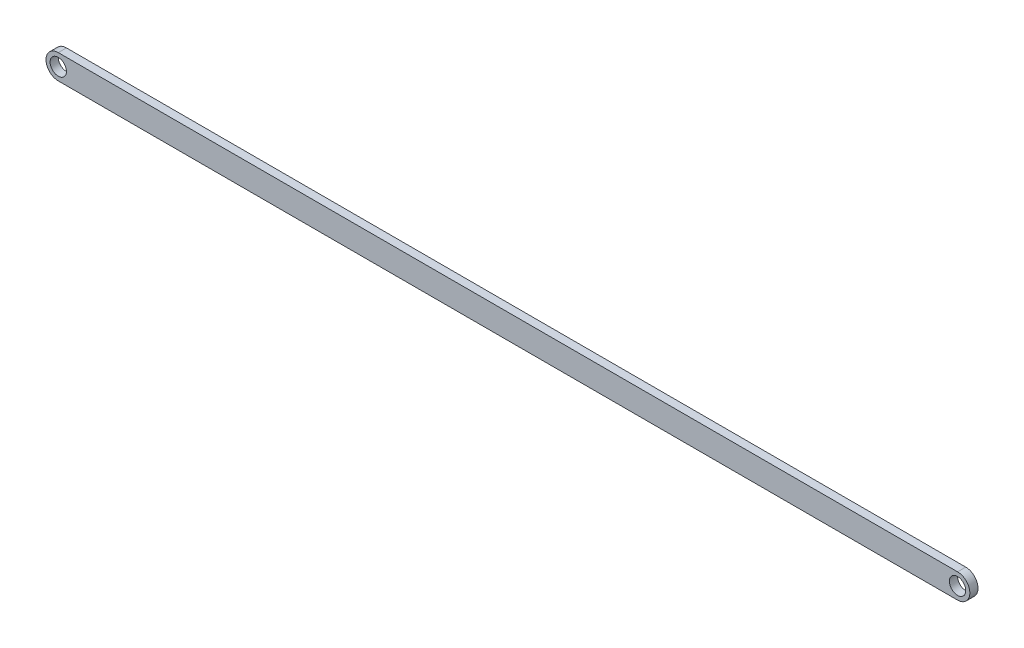
ISO-10303-21;
HEADER;
FILE_DESCRIPTION(('STEP AP214'),'2;1');
FILE_NAME('part.step','',(''),(''),'','','');
FILE_SCHEMA(('AUTOMOTIVE_DESIGN { 1 0 10303 214 1 1 1 1 }'));
ENDSEC;
DATA;
#1=APPLICATION_CONTEXT('core data for automotive mechanical design processes');
#2=APPLICATION_PROTOCOL_DEFINITION('international standard','automotive_design',2000,#1);
#3=PRODUCT_CONTEXT('',#1,'mechanical');
#4=PRODUCT('Part','Part','',(#3));
#5=PRODUCT_RELATED_PRODUCT_CATEGORY('part','',(#4));
#6=PRODUCT_DEFINITION_FORMATION('','',#4);
#7=PRODUCT_DEFINITION_CONTEXT('part definition',#1,'design');
#8=PRODUCT_DEFINITION('design','',#6,#7);
#9=PRODUCT_DEFINITION_SHAPE('','',#8);
#10=(LENGTH_UNIT() NAMED_UNIT(*) SI_UNIT(.MILLI.,.METRE.));
#11=(NAMED_UNIT(*) PLANE_ANGLE_UNIT() SI_UNIT($,.RADIAN.));
#12=(NAMED_UNIT(*) SI_UNIT($,.STERADIAN.) SOLID_ANGLE_UNIT());
#13=UNCERTAINTY_MEASURE_WITH_UNIT(LENGTH_MEASURE(1.E-05),#10,'distance_accuracy_value','');
#14=(GEOMETRIC_REPRESENTATION_CONTEXT(3) GLOBAL_UNCERTAINTY_ASSIGNED_CONTEXT((#13)) GLOBAL_UNIT_ASSIGNED_CONTEXT((#10,
#11,#12)) REPRESENTATION_CONTEXT('',''));
#15=CARTESIAN_POINT('',(0.,0.,0.));
#16=DIRECTION('',(0.,0.,1.));
#17=DIRECTION('',(1.,0.,0.));
#18=AXIS2_PLACEMENT_3D('',#15,#16,#17);
#19=CARTESIAN_POINT('',(0.,0.,1.));
#20=DIRECTION('',(0.,0.,-1.));
#21=DIRECTION('',(-1.,0.,0.));
#22=AXIS2_PLACEMENT_3D('',#19,#20,#21);
#23=CYLINDRICAL_SURFACE('',#22,1.5);
#24=CARTESIAN_POINT('',(0.,0.,0.));
#25=DIRECTION('',(0.,0.,1.));
#26=DIRECTION('',(1.,0.,0.));
#27=AXIS2_PLACEMENT_3D('',#24,#25,#26);
#28=CIRCLE('',#27,1.5);
#29=CARTESIAN_POINT('',(0.,1.5,0.));
#30=VERTEX_POINT('',#29);
#31=CARTESIAN_POINT('',(0.,-1.5,0.));
#32=VERTEX_POINT('',#31);
#33=EDGE_CURVE('E100',#30,#32,#28,.T.);
#34=ORIENTED_EDGE('',*,*,#33,.T.);
#35=DIRECTION('',(0.,0.,-1.));
#36=VECTOR('',#35,1.);
#37=CARTESIAN_POINT('',(0.,-1.5,1.));
#38=LINE('',#37,#36);
#39=CARTESIAN_POINT('',(0.,-1.5,1.));
#40=VERTEX_POINT('',#39);
#41=EDGE_CURVE('E11',#40,#32,#38,.T.);
#42=ORIENTED_EDGE('',*,*,#41,.F.);
#43=CARTESIAN_POINT('',(0.,0.,1.));
#44=DIRECTION('',(0.,0.,1.));
#45=DIRECTION('',(1.,0.,0.));
#46=AXIS2_PLACEMENT_3D('',#43,#44,#45);
#47=CIRCLE('',#46,1.5);
#48=CARTESIAN_POINT('',(0.,1.5,1.));
#49=VERTEX_POINT('',#48);
#50=EDGE_CURVE('E88',#49,#40,#47,.T.);
#51=ORIENTED_EDGE('',*,*,#50,.F.);
#52=DIRECTION('',(0.,0.,-1.));
#53=VECTOR('',#52,1.);
#54=CARTESIAN_POINT('',(0.,1.5,1.));
#55=LINE('',#54,#53);
#56=EDGE_CURVE('E96',#49,#30,#55,.T.);
#57=ORIENTED_EDGE('',*,*,#56,.T.);
#58=EDGE_LOOP('',(#34,#42,#51,#57));
#59=FACE_BOUND('',#58,.T.);
#60=ADVANCED_FACE('F37',(#59),#23,.T.);
#61=CARTESIAN_POINT('',(0.,-1.5,1.));
#62=DIRECTION('',(0.,1.,0.));
#63=DIRECTION('',(0.,0.,1.));
#64=AXIS2_PLACEMENT_3D('',#61,#62,#63);
#65=PLANE('',#64);
#66=DIRECTION('',(1.,0.,0.));
#67=VECTOR('',#66,1.);
#68=CARTESIAN_POINT('',(0.,-1.5,0.));
#69=LINE('',#68,#67);
#70=CARTESIAN_POINT('',(110.,-1.5,0.));
#71=VERTEX_POINT('',#70);
#72=EDGE_CURVE('E92',#32,#71,#69,.T.);
#73=ORIENTED_EDGE('',*,*,#72,.T.);
#74=DIRECTION('',(0.,0.,-1.));
#75=VECTOR('',#74,1.);
#76=CARTESIAN_POINT('',(110.,-1.5,1.));
#77=LINE('',#76,#75);
#78=CARTESIAN_POINT('',(110.,-1.5,1.));
#79=VERTEX_POINT('',#78);
#80=EDGE_CURVE('E45',#79,#71,#77,.T.);
#81=ORIENTED_EDGE('',*,*,#80,.F.);
#82=DIRECTION('',(1.,0.,0.));
#83=VECTOR('',#82,1.);
#84=CARTESIAN_POINT('',(0.,-1.5,1.));
#85=LINE('',#84,#83);
#86=EDGE_CURVE('E83',#40,#79,#85,.T.);
#87=ORIENTED_EDGE('',*,*,#86,.F.);
#88=ORIENTED_EDGE('',*,*,#41,.T.);
#89=EDGE_LOOP('',(#73,#81,#87,#88));
#90=FACE_BOUND('',#89,.T.);
#91=ADVANCED_FACE('F91',(#90),#65,.F.);
#92=CARTESIAN_POINT('',(110.,0.,1.));
#93=DIRECTION('',(0.,0.,-1.));
#94=DIRECTION('',(-1.,0.,0.));
#95=AXIS2_PLACEMENT_3D('',#92,#93,#94);
#96=CYLINDRICAL_SURFACE('',#95,1.5);
#97=CARTESIAN_POINT('',(110.,0.,0.));
#98=DIRECTION('',(0.,0.,1.));
#99=DIRECTION('',(1.,0.,0.));
#100=AXIS2_PLACEMENT_3D('',#97,#98,#99);
#101=CIRCLE('',#100,1.5);
#102=CARTESIAN_POINT('',(110.,1.5,0.));
#103=VERTEX_POINT('',#102);
#104=EDGE_CURVE('E70',#71,#103,#101,.T.);
#105=ORIENTED_EDGE('',*,*,#104,.T.);
#106=DIRECTION('',(0.,0.,-1.));
#107=VECTOR('',#106,1.);
#108=CARTESIAN_POINT('',(110.,1.5,1.));
#109=LINE('',#108,#107);
#110=CARTESIAN_POINT('',(110.,1.5,1.));
#111=VERTEX_POINT('',#110);
#112=EDGE_CURVE('E93',#111,#103,#109,.T.);
#113=ORIENTED_EDGE('',*,*,#112,.F.);
#114=CARTESIAN_POINT('',(110.,0.,1.));
#115=DIRECTION('',(0.,0.,1.));
#116=DIRECTION('',(1.,0.,0.));
#117=AXIS2_PLACEMENT_3D('',#114,#115,#116);
#118=CIRCLE('',#117,1.5);
#119=EDGE_CURVE('E86',#79,#111,#118,.T.);
#120=ORIENTED_EDGE('',*,*,#119,.F.);
#121=ORIENTED_EDGE('',*,*,#80,.T.);
#122=EDGE_LOOP('',(#105,#113,#120,#121));
#123=FACE_BOUND('',#122,.T.);
#124=ADVANCED_FACE('F94',(#123),#96,.T.);
#125=CARTESIAN_POINT('',(0.,1.5,1.));
#126=DIRECTION('',(0.,-1.,0.));
#127=DIRECTION('',(0.,0.,-1.));
#128=AXIS2_PLACEMENT_3D('',#125,#126,#127);
#129=PLANE('',#128);
#130=DIRECTION('',(-1.,0.,0.));
#131=VECTOR('',#130,1.);
#132=CARTESIAN_POINT('',(0.,1.5,0.));
#133=LINE('',#132,#131);
#134=EDGE_CURVE('E76',#103,#30,#133,.T.);
#135=ORIENTED_EDGE('',*,*,#134,.T.);
#136=ORIENTED_EDGE('',*,*,#56,.F.);
#137=DIRECTION('',(-1.,0.,0.));
#138=VECTOR('',#137,1.);
#139=CARTESIAN_POINT('',(0.,1.5,1.));
#140=LINE('',#139,#138);
#141=EDGE_CURVE('E53',#111,#49,#140,.T.);
#142=ORIENTED_EDGE('',*,*,#141,.F.);
#143=ORIENTED_EDGE('',*,*,#112,.T.);
#144=EDGE_LOOP('',(#135,#136,#142,#143));
#145=FACE_BOUND('',#144,.T.);
#146=ADVANCED_FACE('F108',(#145),#129,.F.);
#147=CARTESIAN_POINT('',(0.,0.,1.));
#148=DIRECTION('',(0.,0.,1.));
#149=DIRECTION('',(1.,0.,0.));
#150=AXIS2_PLACEMENT_3D('',#147,#148,#149);
#151=PLANE('',#150);
#152=CARTESIAN_POINT('',(0.,0.,1.));
#153=DIRECTION('',(0.,0.,1.));
#154=DIRECTION('',(1.,0.,0.));
#155=AXIS2_PLACEMENT_3D('',#152,#153,#154);
#156=CIRCLE('',#155,1.);
#157=CARTESIAN_POINT('',(1.00000000000001,0.,1.));
#158=VERTEX_POINT('',#157);
#159=EDGE_CURVE('E117',#158,#158,#156,.T.);
#160=ORIENTED_EDGE('',*,*,#159,.F.);
#161=EDGE_LOOP('',(#160));
#162=FACE_BOUND('',#161,.T.);
#163=CARTESIAN_POINT('',(110.,0.,1.));
#164=DIRECTION('',(0.,0.,1.));
#165=DIRECTION('',(1.,0.,0.));
#166=AXIS2_PLACEMENT_3D('',#163,#164,#165);
#167=CIRCLE('',#166,0.999999999999984);
#168=CARTESIAN_POINT('',(111.,0.,1.));
#169=VERTEX_POINT('',#168);
#170=EDGE_CURVE('E114',#169,#169,#167,.T.);
#171=ORIENTED_EDGE('',*,*,#170,.F.);
#172=EDGE_LOOP('',(#171));
#173=FACE_BOUND('',#172,.T.);
#174=ORIENTED_EDGE('',*,*,#50,.T.);
#175=ORIENTED_EDGE('',*,*,#86,.T.);
#176=ORIENTED_EDGE('',*,*,#119,.T.);
#177=ORIENTED_EDGE('',*,*,#141,.T.);
#178=EDGE_LOOP('',(#174,#175,#176,#177));
#179=FACE_BOUND('',#178,.T.);
#180=ADVANCED_FACE('F84',(#162,#173,#179),#151,.T.);
#181=CARTESIAN_POINT('',(0.,0.,0.));
#182=DIRECTION('',(0.,0.,1.));
#183=DIRECTION('',(1.,0.,0.));
#184=AXIS2_PLACEMENT_3D('',#181,#182,#183);
#185=PLANE('',#184);
#186=CARTESIAN_POINT('',(0.,0.,0.));
#187=DIRECTION('',(0.,0.,1.));
#188=DIRECTION('',(1.,0.,0.));
#189=AXIS2_PLACEMENT_3D('',#186,#187,#188);
#190=CIRCLE('',#189,1.);
#191=CARTESIAN_POINT('',(1.00000000000001,0.,0.));
#192=VERTEX_POINT('',#191);
#193=EDGE_CURVE('E103',#192,#192,#190,.F.);
#194=ORIENTED_EDGE('',*,*,#193,.F.);
#195=EDGE_LOOP('',(#194));
#196=FACE_BOUND('',#195,.T.);
#197=CARTESIAN_POINT('',(110.,0.,0.));
#198=DIRECTION('',(0.,0.,1.));
#199=DIRECTION('',(1.,0.,0.));
#200=AXIS2_PLACEMENT_3D('',#197,#198,#199);
#201=CIRCLE('',#200,0.999999999999984);
#202=CARTESIAN_POINT('',(111.,0.,0.));
#203=VERTEX_POINT('',#202);
#204=EDGE_CURVE('E118',#203,#203,#201,.F.);
#205=ORIENTED_EDGE('',*,*,#204,.F.);
#206=EDGE_LOOP('',(#205));
#207=FACE_BOUND('',#206,.T.);
#208=ORIENTED_EDGE('',*,*,#33,.F.);
#209=ORIENTED_EDGE('',*,*,#134,.F.);
#210=ORIENTED_EDGE('',*,*,#104,.F.);
#211=ORIENTED_EDGE('',*,*,#72,.F.);
#212=EDGE_LOOP('',(#208,#209,#210,#211));
#213=FACE_BOUND('',#212,.T.);
#214=ADVANCED_FACE('F111',(#196,#207,#213),#185,.F.);
#215=CARTESIAN_POINT('',(110.,0.,-0.000999999999999916));
#216=DIRECTION('',(0.,0.,1.));
#217=DIRECTION('',(1.,0.,0.));
#218=AXIS2_PLACEMENT_3D('',#215,#216,#217);
#219=CYLINDRICAL_SURFACE('',#218,0.999999999999984);
#220=ORIENTED_EDGE('',*,*,#170,.T.);
#221=EDGE_LOOP('',(#220));
#222=FACE_BOUND('',#221,.T.);
#223=ORIENTED_EDGE('',*,*,#204,.T.);
#224=EDGE_LOOP('',(#223));
#225=FACE_BOUND('',#224,.T.);
#226=ADVANCED_FACE('F134',(#222,#225),#219,.F.);
#227=CARTESIAN_POINT('',(0.,0.,-0.000999999999999916));
#228=DIRECTION('',(0.,0.,1.));
#229=DIRECTION('',(1.,0.,0.));
#230=AXIS2_PLACEMENT_3D('',#227,#228,#229);
#231=CYLINDRICAL_SURFACE('',#230,1.);
#232=ORIENTED_EDGE('',*,*,#159,.T.);
#233=EDGE_LOOP('',(#232));
#234=FACE_BOUND('',#233,.T.);
#235=ORIENTED_EDGE('',*,*,#193,.T.);
#236=EDGE_LOOP('',(#235));
#237=FACE_BOUND('',#236,.T.);
#238=ADVANCED_FACE('F126',(#234,#237),#231,.F.);
#239=CLOSED_SHELL('',(#60,#91,#124,#146,#180,#214,#226,#238));
#240=MANIFOLD_SOLID_BREP('B2',#239);
#241=ADVANCED_BREP_SHAPE_REPRESENTATION('',(#18,#240),#14);
#242=SHAPE_DEFINITION_REPRESENTATION(#9,#241);
ENDSEC;
END-ISO-10303-21;
